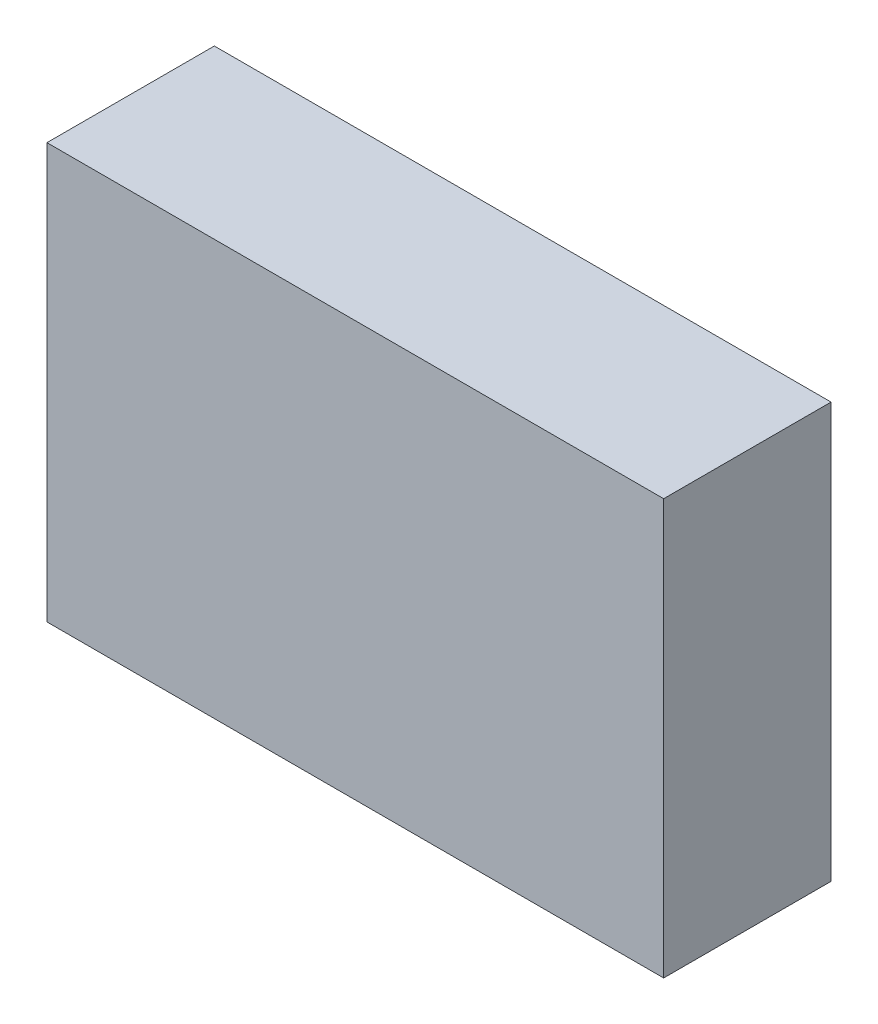
ISO-10303-21;
HEADER;
FILE_DESCRIPTION(('STEP AP214'),'2;1');
FILE_NAME('part.step','',(''),(''),'','','');
FILE_SCHEMA(('AUTOMOTIVE_DESIGN { 1 0 10303 214 1 1 1 1 }'));
ENDSEC;
DATA;
#1=APPLICATION_CONTEXT('core data for automotive mechanical design processes');
#2=APPLICATION_PROTOCOL_DEFINITION('international standard','automotive_design',2000,#1);
#3=PRODUCT_CONTEXT('',#1,'mechanical');
#4=PRODUCT('Part','Part','',(#3));
#5=PRODUCT_RELATED_PRODUCT_CATEGORY('part','',(#4));
#6=PRODUCT_DEFINITION_FORMATION('','',#4);
#7=PRODUCT_DEFINITION_CONTEXT('part definition',#1,'design');
#8=PRODUCT_DEFINITION('design','',#6,#7);
#9=PRODUCT_DEFINITION_SHAPE('','',#8);
#10=(LENGTH_UNIT() NAMED_UNIT(*) SI_UNIT(.MILLI.,.METRE.));
#11=(NAMED_UNIT(*) PLANE_ANGLE_UNIT() SI_UNIT($,.RADIAN.));
#12=(NAMED_UNIT(*) SI_UNIT($,.STERADIAN.) SOLID_ANGLE_UNIT());
#13=UNCERTAINTY_MEASURE_WITH_UNIT(LENGTH_MEASURE(1.E-05),#10,'distance_accuracy_value','');
#14=(GEOMETRIC_REPRESENTATION_CONTEXT(3) GLOBAL_UNCERTAINTY_ASSIGNED_CONTEXT((#13)) GLOBAL_UNIT_ASSIGNED_CONTEXT((#10,
#11,#12)) REPRESENTATION_CONTEXT('',''));
#15=CARTESIAN_POINT('',(0.,0.,0.));
#16=DIRECTION('',(0.,0.,1.));
#17=DIRECTION('',(1.,0.,0.));
#18=AXIS2_PLACEMENT_3D('',#15,#16,#17);
#19=CARTESIAN_POINT('',(0.,0.,18.24));
#20=DIRECTION('',(1.,0.,0.));
#21=DIRECTION('',(0.,1.,0.));
#22=AXIS2_PLACEMENT_3D('',#19,#20,#21);
#23=PLANE('',#22);
#24=DIRECTION('',(0.,-1.,0.));
#25=VECTOR('',#24,1.);
#26=CARTESIAN_POINT('',(0.,0.,0.));
#27=LINE('',#26,#25);
#28=CARTESIAN_POINT('',(0.,0.,0.));
#29=VERTEX_POINT('',#28);
#30=CARTESIAN_POINT('',(0.,-45.23,0.));
#31=VERTEX_POINT('',#30);
#32=EDGE_CURVE('E105',#29,#31,#27,.T.);
#33=ORIENTED_EDGE('',*,*,#32,.T.);
#34=DIRECTION('',(0.,0.,-1.));
#35=VECTOR('',#34,1.);
#36=CARTESIAN_POINT('',(0.,-45.23,18.24));
#37=LINE('',#36,#35);
#38=CARTESIAN_POINT('',(0.,-45.23,18.24));
#39=VERTEX_POINT('',#38);
#40=EDGE_CURVE('E11',#39,#31,#37,.T.);
#41=ORIENTED_EDGE('',*,*,#40,.F.);
#42=DIRECTION('',(0.,-1.,0.));
#43=VECTOR('',#42,1.);
#44=CARTESIAN_POINT('',(0.,0.,18.24));
#45=LINE('',#44,#43);
#46=CARTESIAN_POINT('',(0.,0.,18.24));
#47=VERTEX_POINT('',#46);
#48=EDGE_CURVE('E89',#47,#39,#45,.T.);
#49=ORIENTED_EDGE('',*,*,#48,.F.);
#50=DIRECTION('',(0.,0.,-1.));
#51=VECTOR('',#50,1.);
#52=CARTESIAN_POINT('',(0.,0.,18.24));
#53=LINE('',#52,#51);
#54=EDGE_CURVE('E98',#47,#29,#53,.T.);
#55=ORIENTED_EDGE('',*,*,#54,.T.);
#56=EDGE_LOOP('',(#33,#41,#49,#55));
#57=FACE_BOUND('',#56,.T.);
#58=ADVANCED_FACE('F39',(#57),#23,.F.);
#59=CARTESIAN_POINT('',(0.,-45.23,18.24));
#60=DIRECTION('',(0.,1.,0.));
#61=DIRECTION('',(0.,0.,1.));
#62=AXIS2_PLACEMENT_3D('',#59,#60,#61);
#63=PLANE('',#62);
#64=DIRECTION('',(1.,0.,0.));
#65=VECTOR('',#64,1.);
#66=CARTESIAN_POINT('',(0.,-45.23,0.));
#67=LINE('',#66,#65);
#68=CARTESIAN_POINT('',(67.2,-45.23,0.));
#69=VERTEX_POINT('',#68);
#70=EDGE_CURVE('E94',#31,#69,#67,.T.);
#71=ORIENTED_EDGE('',*,*,#70,.T.);
#72=DIRECTION('',(0.,0.,-1.));
#73=VECTOR('',#72,1.);
#74=CARTESIAN_POINT('',(67.2,-45.23,18.24));
#75=LINE('',#74,#73);
#76=CARTESIAN_POINT('',(67.2,-45.23,18.24));
#77=VERTEX_POINT('',#76);
#78=EDGE_CURVE('E50',#77,#69,#75,.T.);
#79=ORIENTED_EDGE('',*,*,#78,.F.);
#80=DIRECTION('',(1.,0.,0.));
#81=VECTOR('',#80,1.);
#82=CARTESIAN_POINT('',(0.,-45.23,18.24));
#83=LINE('',#82,#81);
#84=EDGE_CURVE('E81',#39,#77,#83,.T.);
#85=ORIENTED_EDGE('',*,*,#84,.F.);
#86=ORIENTED_EDGE('',*,*,#40,.T.);
#87=EDGE_LOOP('',(#71,#79,#85,#86));
#88=FACE_BOUND('',#87,.T.);
#89=ADVANCED_FACE('F91',(#88),#63,.F.);
#90=CARTESIAN_POINT('',(67.2,0.,18.24));
#91=DIRECTION('',(-1.,0.,0.));
#92=DIRECTION('',(0.,0.,1.));
#93=AXIS2_PLACEMENT_3D('',#90,#91,#92);
#94=PLANE('',#93);
#95=DIRECTION('',(0.,1.,0.));
#96=VECTOR('',#95,1.);
#97=CARTESIAN_POINT('',(67.2,0.,0.));
#98=LINE('',#97,#96);
#99=CARTESIAN_POINT('',(67.2,0.,0.));
#100=VERTEX_POINT('',#99);
#101=EDGE_CURVE('E75',#69,#100,#98,.T.);
#102=ORIENTED_EDGE('',*,*,#101,.T.);
#103=DIRECTION('',(0.,0.,-1.));
#104=VECTOR('',#103,1.);
#105=CARTESIAN_POINT('',(67.2,0.,18.24));
#106=LINE('',#105,#104);
#107=CARTESIAN_POINT('',(67.2,0.,18.24));
#108=VERTEX_POINT('',#107);
#109=EDGE_CURVE('E92',#108,#100,#106,.T.);
#110=ORIENTED_EDGE('',*,*,#109,.F.);
#111=DIRECTION('',(0.,1.,0.));
#112=VECTOR('',#111,1.);
#113=CARTESIAN_POINT('',(67.2,0.,18.24));
#114=LINE('',#113,#112);
#115=EDGE_CURVE('E86',#77,#108,#114,.T.);
#116=ORIENTED_EDGE('',*,*,#115,.F.);
#117=ORIENTED_EDGE('',*,*,#78,.T.);
#118=EDGE_LOOP('',(#102,#110,#116,#117));
#119=FACE_BOUND('',#118,.T.);
#120=ADVANCED_FACE('F96',(#119),#94,.F.);
#121=CARTESIAN_POINT('',(0.,0.,18.24));
#122=DIRECTION('',(0.,-1.,0.));
#123=DIRECTION('',(0.,0.,-1.));
#124=AXIS2_PLACEMENT_3D('',#121,#122,#123);
#125=PLANE('',#124);
#126=DIRECTION('',(-1.,0.,0.));
#127=VECTOR('',#126,1.);
#128=CARTESIAN_POINT('',(0.,0.,0.));
#129=LINE('',#128,#127);
#130=EDGE_CURVE('E77',#100,#29,#129,.T.);
#131=ORIENTED_EDGE('',*,*,#130,.T.);
#132=ORIENTED_EDGE('',*,*,#54,.F.);
#133=DIRECTION('',(-1.,0.,0.));
#134=VECTOR('',#133,1.);
#135=CARTESIAN_POINT('',(0.,0.,18.24));
#136=LINE('',#135,#134);
#137=EDGE_CURVE('E54',#108,#47,#136,.T.);
#138=ORIENTED_EDGE('',*,*,#137,.F.);
#139=ORIENTED_EDGE('',*,*,#109,.T.);
#140=EDGE_LOOP('',(#131,#132,#138,#139));
#141=FACE_BOUND('',#140,.T.);
#142=ADVANCED_FACE('F108',(#141),#125,.F.);
#143=CARTESIAN_POINT('',(0.,0.,18.24));
#144=DIRECTION('',(0.,0.,1.));
#145=DIRECTION('',(1.,0.,0.));
#146=AXIS2_PLACEMENT_3D('',#143,#144,#145);
#147=PLANE('',#146);
#148=ORIENTED_EDGE('',*,*,#48,.T.);
#149=ORIENTED_EDGE('',*,*,#84,.T.);
#150=ORIENTED_EDGE('',*,*,#115,.T.);
#151=ORIENTED_EDGE('',*,*,#137,.T.);
#152=EDGE_LOOP('',(#148,#149,#150,#151));
#153=FACE_BOUND('',#152,.T.);
#154=ADVANCED_FACE('F88',(#153),#147,.T.);
#155=CARTESIAN_POINT('',(0.,0.,0.));
#156=DIRECTION('',(0.,0.,1.));
#157=DIRECTION('',(1.,0.,0.));
#158=AXIS2_PLACEMENT_3D('',#155,#156,#157);
#159=PLANE('',#158);
#160=ORIENTED_EDGE('',*,*,#32,.F.);
#161=ORIENTED_EDGE('',*,*,#130,.F.);
#162=ORIENTED_EDGE('',*,*,#101,.F.);
#163=ORIENTED_EDGE('',*,*,#70,.F.);
#164=EDGE_LOOP('',(#160,#161,#162,#163));
#165=FACE_BOUND('',#164,.T.);
#166=ADVANCED_FACE('F115',(#165),#159,.F.);
#167=CLOSED_SHELL('',(#58,#89,#120,#142,#154,#166));
#168=MANIFOLD_SOLID_BREP('B2',#167);
#169=ADVANCED_BREP_SHAPE_REPRESENTATION('',(#18,#168),#14);
#170=SHAPE_DEFINITION_REPRESENTATION(#9,#169);
ENDSEC;
END-ISO-10303-21;
